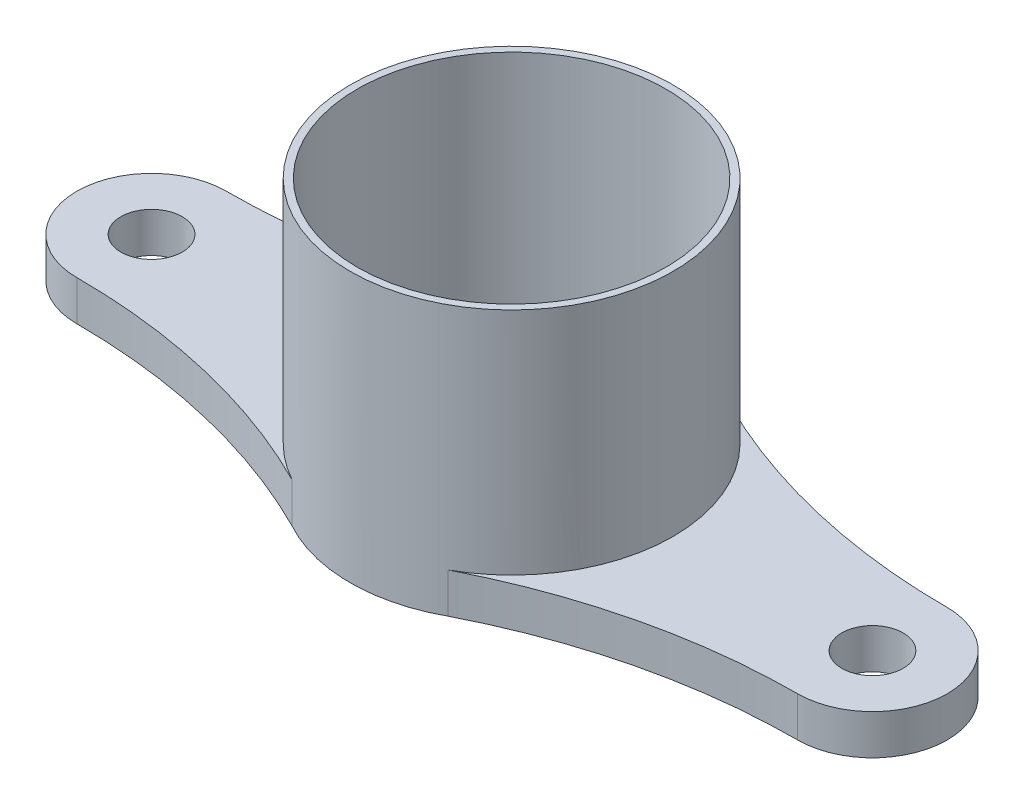
ISO-10303-21;
HEADER;
FILE_DESCRIPTION(('STEP AP214'),'2;1');
FILE_NAME('part.step','',(''),(''),'','','');
FILE_SCHEMA(('AUTOMOTIVE_DESIGN { 1 0 10303 214 1 1 1 1 }'));
ENDSEC;
DATA;
#1=APPLICATION_CONTEXT('core data for automotive mechanical design processes');
#2=APPLICATION_PROTOCOL_DEFINITION('international standard','automotive_design',2000,#1);
#3=PRODUCT_CONTEXT('',#1,'mechanical');
#4=PRODUCT('Part','Part','',(#3));
#5=PRODUCT_RELATED_PRODUCT_CATEGORY('part','',(#4));
#6=PRODUCT_DEFINITION_FORMATION('','',#4);
#7=PRODUCT_DEFINITION_CONTEXT('part definition',#1,'design');
#8=PRODUCT_DEFINITION('design','',#6,#7);
#9=PRODUCT_DEFINITION_SHAPE('','',#8);
#10=(LENGTH_UNIT() NAMED_UNIT(*) SI_UNIT(.MILLI.,.METRE.));
#11=(NAMED_UNIT(*) PLANE_ANGLE_UNIT() SI_UNIT($,.RADIAN.));
#12=(NAMED_UNIT(*) SI_UNIT($,.STERADIAN.) SOLID_ANGLE_UNIT());
#13=UNCERTAINTY_MEASURE_WITH_UNIT(LENGTH_MEASURE(1.E-05),#10,'distance_accuracy_value','');
#14=(GEOMETRIC_REPRESENTATION_CONTEXT(3) GLOBAL_UNCERTAINTY_ASSIGNED_CONTEXT((#13)) GLOBAL_UNIT_ASSIGNED_CONTEXT((#10,
#11,#12)) REPRESENTATION_CONTEXT('',''));
#15=CARTESIAN_POINT('',(0.,0.,0.));
#16=DIRECTION('',(0.,0.,1.));
#17=DIRECTION('',(1.,0.,0.));
#18=AXIS2_PLACEMENT_3D('',#15,#16,#17);
#19=CARTESIAN_POINT('',(0.,1.5,0.));
#20=DIRECTION('',(0.,1.,0.));
#21=DIRECTION('',(0.,0.,1.));
#22=AXIS2_PLACEMENT_3D('',#19,#20,#21);
#23=PLANE('',#22);
#24=CARTESIAN_POINT('',(-13.5176419804261,1.5,-0.031970109339721));
#25=DIRECTION('',(0.,1.,0.));
#26=DIRECTION('',(0.,0.,1.));
#27=AXIS2_PLACEMENT_3D('',#24,#25,#26);
#28=CIRCLE('',#27,1.15);
#29=CARTESIAN_POINT('',(-13.5176419804261,1.5,1.11802989066028));
#30=VERTEX_POINT('',#29);
#31=EDGE_CURVE('E141',#30,#30,#28,.T.);
#32=ORIENTED_EDGE('',*,*,#31,.F.);
#33=EDGE_LOOP('',(#32));
#34=FACE_BOUND('',#33,.T.);
#35=CARTESIAN_POINT('',(-13.5176419804261,1.5,26.2243705707502));
#36=DIRECTION('',(0.,1.,0.));
#37=DIRECTION('',(0.,0.,1.));
#38=AXIS2_PLACEMENT_3D('',#35,#36,#37);
#39=CIRCLE('',#38,23.4563406800899);
#40=CARTESIAN_POINT('',(-13.5176419804261,1.5,2.76802989066028));
#41=VERTEX_POINT('',#40);
#42=CARTESIAN_POINT('',(-2.92303701075554,1.5,5.29701374679671));
#43=VERTEX_POINT('',#42);
#44=EDGE_CURVE('E91',#41,#43,#39,.F.);
#45=ORIENTED_EDGE('',*,*,#44,.T.);
#46=CARTESIAN_POINT('',(0.,1.5,0.));
#47=DIRECTION('',(0.,1.,0.));
#48=DIRECTION('',(0.,0.,1.));
#49=AXIS2_PLACEMENT_3D('',#46,#47,#48);
#50=CIRCLE('',#49,6.05);
#51=CARTESIAN_POINT('',(-2.92303701075541,1.5,-5.29701374679678));
#52=VERTEX_POINT('',#51);
#53=EDGE_CURVE('E133',#43,#52,#50,.F.);
#54=ORIENTED_EDGE('',*,*,#53,.T.);
#55=CARTESIAN_POINT('',(-13.5176419804261,1.5,-26.8319701093397));
#56=DIRECTION('',(0.,1.,0.));
#57=DIRECTION('',(0.,0.,1.));
#58=AXIS2_PLACEMENT_3D('',#55,#56,#57);
#59=CIRCLE('',#58,24.);
#60=CARTESIAN_POINT('',(-13.5176419804261,1.5,-2.83197010933972));
#61=VERTEX_POINT('',#60);
#62=EDGE_CURVE('E117',#61,#52,#59,.T.);
#63=ORIENTED_EDGE('',*,*,#62,.F.);
#64=CARTESIAN_POINT('',(-13.5176419804261,1.5,-0.031970109339721));
#65=DIRECTION('',(0.,1.,0.));
#66=DIRECTION('',(0.,0.,1.));
#67=AXIS2_PLACEMENT_3D('',#64,#65,#66);
#68=CIRCLE('',#67,2.8);
#69=EDGE_CURVE('E144',#61,#41,#68,.T.);
#70=ORIENTED_EDGE('',*,*,#69,.T.);
#71=EDGE_LOOP('',(#45,#54,#63,#70));
#72=FACE_BOUND('',#71,.T.);
#73=ADVANCED_FACE('F32',(#34,#72),#23,.T.);
#74=CARTESIAN_POINT('',(0.,1.5,0.));
#75=DIRECTION('',(0.,1.,0.));
#76=DIRECTION('',(0.,0.,1.));
#77=AXIS2_PLACEMENT_3D('',#74,#75,#76);
#78=CIRCLE('',#77,2.85);
#79=CARTESIAN_POINT('',(0.,1.5,2.85));
#80=VERTEX_POINT('',#79);
#81=EDGE_CURVE('E153',#80,#80,#78,.T.);
#82=ORIENTED_EDGE('',*,*,#81,.F.);
#83=EDGE_LOOP('',(#82));
#84=FACE_BOUND('',#83,.T.);
#85=CARTESIAN_POINT('',(0.,1.5,0.));
#86=DIRECTION('',(0.,1.,0.));
#87=DIRECTION('',(0.,0.,1.));
#88=AXIS2_PLACEMENT_3D('',#85,#86,#87);
#89=CIRCLE('',#88,5.78192035093867);
#90=CARTESIAN_POINT('',(0.,1.5,5.78192035093867));
#91=VERTEX_POINT('',#90);
#92=EDGE_CURVE('E11',#91,#91,#89,.F.);
#93=ORIENTED_EDGE('',*,*,#92,.F.);
#94=EDGE_LOOP('',(#93));
#95=FACE_BOUND('',#94,.T.);
#96=ADVANCED_FACE('F211',(#84,#95),#23,.T.);
#97=CARTESIAN_POINT('',(-13.5176419804261,1.5,-0.031970109339721));
#98=DIRECTION('',(0.,-1.,0.));
#99=DIRECTION('',(0.,0.,-1.));
#100=AXIS2_PLACEMENT_3D('',#97,#98,#99);
#101=CYLINDRICAL_SURFACE('',#100,2.8);
#102=CARTESIAN_POINT('',(-13.5176419804261,0.,-0.031970109339721));
#103=DIRECTION('',(0.,1.,0.));
#104=DIRECTION('',(0.,0.,1.));
#105=AXIS2_PLACEMENT_3D('',#102,#103,#104);
#106=CIRCLE('',#105,2.8);
#107=CARTESIAN_POINT('',(-13.5176419804261,0.,-2.83197010933972));
#108=VERTEX_POINT('',#107);
#109=CARTESIAN_POINT('',(-13.5176419804261,0.,2.76802989066028));
#110=VERTEX_POINT('',#109);
#111=EDGE_CURVE('E161',#108,#110,#106,.T.);
#112=ORIENTED_EDGE('',*,*,#111,.T.);
#113=DIRECTION('',(0.,-1.,0.));
#114=VECTOR('',#113,1.);
#115=CARTESIAN_POINT('',(-13.5176419804261,1.5,2.76802989066028));
#116=LINE('',#115,#114);
#117=EDGE_CURVE('E36',#41,#110,#116,.T.);
#118=ORIENTED_EDGE('',*,*,#117,.F.);
#119=ORIENTED_EDGE('',*,*,#69,.F.);
#120=DIRECTION('',(0.,-1.,0.));
#121=VECTOR('',#120,1.);
#122=CARTESIAN_POINT('',(-13.5176419804261,1.5,-2.83197010933972));
#123=LINE('',#122,#121);
#124=EDGE_CURVE('E50',#61,#108,#123,.T.);
#125=ORIENTED_EDGE('',*,*,#124,.T.);
#126=EDGE_LOOP('',(#112,#118,#119,#125));
#127=FACE_BOUND('',#126,.T.);
#128=ADVANCED_FACE('F193',(#127),#101,.T.);
#129=CARTESIAN_POINT('',(-13.5176419804261,1.5,26.2243705707502));
#130=DIRECTION('',(0.,-1.,0.));
#131=DIRECTION('',(0.,0.,-1.));
#132=AXIS2_PLACEMENT_3D('',#129,#130,#131);
#133=CYLINDRICAL_SURFACE('',#132,23.4563406800899);
#134=CARTESIAN_POINT('',(-13.5176419804261,0.,26.2243705707502));
#135=DIRECTION('',(0.,1.,0.));
#136=DIRECTION('',(0.,0.,1.));
#137=AXIS2_PLACEMENT_3D('',#134,#135,#136);
#138=CIRCLE('',#137,23.4563406800899);
#139=CARTESIAN_POINT('',(-2.92303701075554,0.,5.29701374679671));
#140=VERTEX_POINT('',#139);
#141=EDGE_CURVE('E163',#110,#140,#138,.F.);
#142=ORIENTED_EDGE('',*,*,#141,.T.);
#143=DIRECTION('',(0.,-1.,0.));
#144=VECTOR('',#143,1.);
#145=CARTESIAN_POINT('',(-2.92303701075554,1.5,5.29701374679671));
#146=LINE('',#145,#144);
#147=EDGE_CURVE('E187',#43,#140,#146,.T.);
#148=ORIENTED_EDGE('',*,*,#147,.F.);
#149=ORIENTED_EDGE('',*,*,#44,.F.);
#150=ORIENTED_EDGE('',*,*,#117,.T.);
#151=EDGE_LOOP('',(#142,#148,#149,#150));
#152=FACE_BOUND('',#151,.T.);
#153=ADVANCED_FACE('F192',(#152),#133,.F.);
#154=CARTESIAN_POINT('',(13.4823580195739,1.5,26.0768025476715));
#155=DIRECTION('',(0.,-1.,0.));
#156=DIRECTION('',(0.,0.,-1.));
#157=AXIS2_PLACEMENT_3D('',#154,#155,#156);
#158=CYLINDRICAL_SURFACE('',#157,23.3087726570112);
#159=CARTESIAN_POINT('',(13.4823580195739,0.,26.0768025476715));
#160=DIRECTION('',(0.,1.,0.));
#161=DIRECTION('',(0.,0.,1.));
#162=AXIS2_PLACEMENT_3D('',#159,#160,#161);
#163=CIRCLE('',#162,23.3087726570112);
#164=CARTESIAN_POINT('',(13.4823580195739,0.,2.76802989066028));
#165=VERTEX_POINT('',#164);
#166=CARTESIAN_POINT('',(2.92303701075551,0.,5.29701374679673));
#167=VERTEX_POINT('',#166);
#168=EDGE_CURVE('E167',#165,#167,#163,.T.);
#169=ORIENTED_EDGE('',*,*,#168,.F.);
#170=DIRECTION('',(0.,-1.,0.));
#171=VECTOR('',#170,1.);
#172=CARTESIAN_POINT('',(13.4823580195739,1.5,2.76802989066028));
#173=LINE('',#172,#171);
#174=CARTESIAN_POINT('',(13.4823580195739,1.5,2.76802989066028));
#175=VERTEX_POINT('',#174);
#176=EDGE_CURVE('E185',#175,#165,#173,.T.);
#177=ORIENTED_EDGE('',*,*,#176,.F.);
#178=CARTESIAN_POINT('',(13.4823580195739,1.5,26.0768025476715));
#179=DIRECTION('',(0.,1.,0.));
#180=DIRECTION('',(0.,0.,1.));
#181=AXIS2_PLACEMENT_3D('',#178,#179,#180);
#182=CIRCLE('',#181,23.3087726570112);
#183=CARTESIAN_POINT('',(2.92303701075551,1.5,5.29701374679673));
#184=VERTEX_POINT('',#183);
#185=EDGE_CURVE('E148',#175,#184,#182,.T.);
#186=ORIENTED_EDGE('',*,*,#185,.T.);
#187=DIRECTION('',(0.,-1.,0.));
#188=VECTOR('',#187,1.);
#189=CARTESIAN_POINT('',(2.92303701075551,1.5,5.29701374679673));
#190=LINE('',#189,#188);
#191=EDGE_CURVE('E132',#184,#167,#190,.T.);
#192=ORIENTED_EDGE('',*,*,#191,.T.);
#193=EDGE_LOOP('',(#169,#177,#186,#192));
#194=FACE_BOUND('',#193,.T.);
#195=ADVANCED_FACE('F264',(#194),#158,.F.);
#196=CARTESIAN_POINT('',(13.4823580195739,1.5,-0.0319701093397201));
#197=DIRECTION('',(0.,-1.,0.));
#198=DIRECTION('',(0.,0.,-1.));
#199=AXIS2_PLACEMENT_3D('',#196,#197,#198);
#200=CYLINDRICAL_SURFACE('',#199,2.8);
#201=CARTESIAN_POINT('',(13.4823580195739,0.,-0.0319701093397201));
#202=DIRECTION('',(0.,1.,0.));
#203=DIRECTION('',(0.,0.,1.));
#204=AXIS2_PLACEMENT_3D('',#201,#202,#203);
#205=CIRCLE('',#204,2.8);
#206=CARTESIAN_POINT('',(13.4823580195739,0.,-2.83197010933972));
#207=VERTEX_POINT('',#206);
#208=EDGE_CURVE('E171',#165,#207,#205,.T.);
#209=ORIENTED_EDGE('',*,*,#208,.T.);
#210=DIRECTION('',(0.,-1.,0.));
#211=VECTOR('',#210,1.);
#212=CARTESIAN_POINT('',(13.4823580195739,1.5,-2.83197010933972));
#213=LINE('',#212,#211);
#214=CARTESIAN_POINT('',(13.4823580195739,1.5,-2.83197010933972));
#215=VERTEX_POINT('',#214);
#216=EDGE_CURVE('E126',#215,#207,#213,.T.);
#217=ORIENTED_EDGE('',*,*,#216,.F.);
#218=CARTESIAN_POINT('',(13.4823580195739,1.5,-0.0319701093397201));
#219=DIRECTION('',(0.,1.,0.));
#220=DIRECTION('',(0.,0.,1.));
#221=AXIS2_PLACEMENT_3D('',#218,#219,#220);
#222=CIRCLE('',#221,2.8);
#223=EDGE_CURVE('E113',#175,#215,#222,.T.);
#224=ORIENTED_EDGE('',*,*,#223,.F.);
#225=ORIENTED_EDGE('',*,*,#176,.T.);
#226=EDGE_LOOP('',(#209,#217,#224,#225));
#227=FACE_BOUND('',#226,.T.);
#228=ADVANCED_FACE('F259',(#227),#200,.T.);
#229=CARTESIAN_POINT('',(13.4823580195739,1.5,-26.6805743521299));
#230=DIRECTION('',(0.,-1.,0.));
#231=DIRECTION('',(0.,0.,-1.));
#232=AXIS2_PLACEMENT_3D('',#229,#230,#231);
#233=CYLINDRICAL_SURFACE('',#232,23.8486042427902);
#234=CARTESIAN_POINT('',(13.4823580195739,0.,-26.6805743521299));
#235=DIRECTION('',(0.,1.,0.));
#236=DIRECTION('',(0.,0.,1.));
#237=AXIS2_PLACEMENT_3D('',#234,#235,#236);
#238=CIRCLE('',#237,23.8486042427902);
#239=CARTESIAN_POINT('',(2.92303701075546,0.,-5.29701374679675));
#240=VERTEX_POINT('',#239);
#241=EDGE_CURVE('E123',#207,#240,#238,.F.);
#242=ORIENTED_EDGE('',*,*,#241,.T.);
#243=DIRECTION('',(0.,-1.,0.));
#244=VECTOR('',#243,1.);
#245=CARTESIAN_POINT('',(2.92303701075546,1.5,-5.29701374679675));
#246=LINE('',#245,#244);
#247=CARTESIAN_POINT('',(2.92303701075546,1.5,-5.29701374679675));
#248=VERTEX_POINT('',#247);
#249=EDGE_CURVE('E120',#248,#240,#246,.T.);
#250=ORIENTED_EDGE('',*,*,#249,.F.);
#251=CARTESIAN_POINT('',(13.4823580195739,1.5,-26.6805743521299));
#252=DIRECTION('',(0.,1.,0.));
#253=DIRECTION('',(0.,0.,1.));
#254=AXIS2_PLACEMENT_3D('',#251,#252,#253);
#255=CIRCLE('',#254,23.8486042427902);
#256=EDGE_CURVE('E105',#215,#248,#255,.F.);
#257=ORIENTED_EDGE('',*,*,#256,.F.);
#258=ORIENTED_EDGE('',*,*,#216,.T.);
#259=EDGE_LOOP('',(#242,#250,#257,#258));
#260=FACE_BOUND('',#259,.T.);
#261=ADVANCED_FACE('F121',(#260),#233,.F.);
#262=CARTESIAN_POINT('',(0.,1.5,0.));
#263=DIRECTION('',(0.,-1.,0.));
#264=DIRECTION('',(0.,0.,-1.));
#265=AXIS2_PLACEMENT_3D('',#262,#263,#264);
#266=CYLINDRICAL_SURFACE('',#265,6.05);
#267=CARTESIAN_POINT('',(0.,0.,0.));
#268=DIRECTION('',(0.,1.,0.));
#269=DIRECTION('',(0.,0.,1.));
#270=AXIS2_PLACEMENT_3D('',#267,#268,#269);
#271=CIRCLE('',#270,6.05);
#272=CARTESIAN_POINT('',(-2.92303701075541,0.,-5.29701374679678));
#273=VERTEX_POINT('',#272);
#274=EDGE_CURVE('E168',#240,#273,#271,.T.);
#275=ORIENTED_EDGE('',*,*,#274,.T.);
#276=DIRECTION('',(0.,-1.,0.));
#277=VECTOR('',#276,1.);
#278=CARTESIAN_POINT('',(-2.92303701075541,1.5,-5.29701374679678));
#279=LINE('',#278,#277);
#280=EDGE_CURVE('E78',#52,#273,#279,.T.);
#281=ORIENTED_EDGE('',*,*,#280,.F.);
#282=ORIENTED_EDGE('',*,*,#53,.F.);
#283=ORIENTED_EDGE('',*,*,#147,.T.);
#284=EDGE_CURVE('E165',#140,#167,#271,.T.);
#285=ORIENTED_EDGE('',*,*,#284,.T.);
#286=ORIENTED_EDGE('',*,*,#191,.F.);
#287=EDGE_CURVE('E111',#248,#184,#50,.F.);
#288=ORIENTED_EDGE('',*,*,#287,.F.);
#289=ORIENTED_EDGE('',*,*,#249,.T.);
#290=EDGE_LOOP('',(#275,#281,#282,#283,#285,#286,#288,#289));
#291=FACE_BOUND('',#290,.T.);
#292=CARTESIAN_POINT('',(0.,10.1,0.));
#293=DIRECTION('',(0.,1.,0.));
#294=DIRECTION('',(0.,0.,1.));
#295=AXIS2_PLACEMENT_3D('',#292,#293,#294);
#296=CIRCLE('',#295,6.05);
#297=CARTESIAN_POINT('',(0.,10.1,6.05));
#298=VERTEX_POINT('',#297);
#299=EDGE_CURVE('E134',#298,#298,#296,.T.);
#300=ORIENTED_EDGE('',*,*,#299,.F.);
#301=EDGE_LOOP('',(#300));
#302=FACE_BOUND('',#301,.T.);
#303=ADVANCED_FACE('F129',(#291,#302),#266,.T.);
#304=CARTESIAN_POINT('',(0.,1.5,0.));
#305=DIRECTION('',(0.,-1.,0.));
#306=DIRECTION('',(0.,0.,-1.));
#307=AXIS2_PLACEMENT_3D('',#304,#305,#306);
#308=CYLINDRICAL_SURFACE('',#307,2.85);
#309=ORIENTED_EDGE('',*,*,#81,.T.);
#310=EDGE_LOOP('',(#309));
#311=FACE_BOUND('',#310,.T.);
#312=CARTESIAN_POINT('',(0.,0.,0.));
#313=DIRECTION('',(0.,1.,0.));
#314=DIRECTION('',(0.,0.,1.));
#315=AXIS2_PLACEMENT_3D('',#312,#313,#314);
#316=CIRCLE('',#315,2.85);
#317=CARTESIAN_POINT('',(0.,0.,2.85));
#318=VERTEX_POINT('',#317);
#319=EDGE_CURVE('E177',#318,#318,#316,.T.);
#320=ORIENTED_EDGE('',*,*,#319,.F.);
#321=EDGE_LOOP('',(#320));
#322=FACE_BOUND('',#321,.T.);
#323=ADVANCED_FACE('F199',(#311,#322),#308,.F.);
#324=CARTESIAN_POINT('',(-13.5176419804261,1.5,-26.8319701093397));
#325=DIRECTION('',(0.,-1.,0.));
#326=DIRECTION('',(0.,0.,-1.));
#327=AXIS2_PLACEMENT_3D('',#324,#325,#326);
#328=CYLINDRICAL_SURFACE('',#327,24.);
#329=CARTESIAN_POINT('',(-13.5176419804261,0.,-26.8319701093397));
#330=DIRECTION('',(0.,1.,0.));
#331=DIRECTION('',(0.,0.,1.));
#332=AXIS2_PLACEMENT_3D('',#329,#330,#331);
#333=CIRCLE('',#332,24.);
#334=EDGE_CURVE('E174',#108,#273,#333,.T.);
#335=ORIENTED_EDGE('',*,*,#334,.F.);
#336=ORIENTED_EDGE('',*,*,#124,.F.);
#337=ORIENTED_EDGE('',*,*,#62,.T.);
#338=ORIENTED_EDGE('',*,*,#280,.T.);
#339=EDGE_LOOP('',(#335,#336,#337,#338));
#340=FACE_BOUND('',#339,.T.);
#341=ADVANCED_FACE('F197',(#340),#328,.F.);
#342=CARTESIAN_POINT('',(-13.5176419804261,1.5,-0.031970109339721));
#343=DIRECTION('',(0.,-1.,0.));
#344=DIRECTION('',(0.,0.,-1.));
#345=AXIS2_PLACEMENT_3D('',#342,#343,#344);
#346=CYLINDRICAL_SURFACE('',#345,1.15);
#347=ORIENTED_EDGE('',*,*,#31,.T.);
#348=EDGE_LOOP('',(#347));
#349=FACE_BOUND('',#348,.T.);
#350=CARTESIAN_POINT('',(-13.5176419804261,0.,-0.031970109339721));
#351=DIRECTION('',(0.,1.,0.));
#352=DIRECTION('',(0.,0.,1.));
#353=AXIS2_PLACEMENT_3D('',#350,#351,#352);
#354=CIRCLE('',#353,1.15);
#355=CARTESIAN_POINT('',(-13.5176419804261,0.,1.11802989066028));
#356=VERTEX_POINT('',#355);
#357=EDGE_CURVE('E136',#356,#356,#354,.T.);
#358=ORIENTED_EDGE('',*,*,#357,.F.);
#359=EDGE_LOOP('',(#358));
#360=FACE_BOUND('',#359,.T.);
#361=ADVANCED_FACE('F34',(#349,#360),#346,.F.);
#362=CARTESIAN_POINT('',(13.4823580195739,1.5,-0.0319701093397201));
#363=DIRECTION('',(0.,-1.,0.));
#364=DIRECTION('',(0.,0.,-1.));
#365=AXIS2_PLACEMENT_3D('',#362,#363,#364);
#366=CYLINDRICAL_SURFACE('',#365,1.15);
#367=CARTESIAN_POINT('',(13.4823580195739,1.5,-0.0319701093397201));
#368=DIRECTION('',(0.,1.,0.));
#369=DIRECTION('',(0.,0.,1.));
#370=AXIS2_PLACEMENT_3D('',#367,#368,#369);
#371=CIRCLE('',#370,1.15);
#372=CARTESIAN_POINT('',(13.4823580195739,1.5,1.11802989066028));
#373=VERTEX_POINT('',#372);
#374=EDGE_CURVE('E156',#373,#373,#371,.T.);
#375=ORIENTED_EDGE('',*,*,#374,.T.);
#376=EDGE_LOOP('',(#375));
#377=FACE_BOUND('',#376,.T.);
#378=CARTESIAN_POINT('',(13.4823580195739,0.,-0.0319701093397201));
#379=DIRECTION('',(0.,1.,0.));
#380=DIRECTION('',(0.,0.,1.));
#381=AXIS2_PLACEMENT_3D('',#378,#379,#380);
#382=CIRCLE('',#381,1.15);
#383=CARTESIAN_POINT('',(13.4823580195739,0.,1.11802989066028));
#384=VERTEX_POINT('',#383);
#385=EDGE_CURVE('E145',#384,#384,#382,.T.);
#386=ORIENTED_EDGE('',*,*,#385,.F.);
#387=EDGE_LOOP('',(#386));
#388=FACE_BOUND('',#387,.T.);
#389=ADVANCED_FACE('F205',(#377,#388),#366,.F.);
#390=ORIENTED_EDGE('',*,*,#256,.T.);
#391=ORIENTED_EDGE('',*,*,#287,.T.);
#392=ORIENTED_EDGE('',*,*,#185,.F.);
#393=ORIENTED_EDGE('',*,*,#223,.T.);
#394=EDGE_LOOP('',(#390,#391,#392,#393));
#395=FACE_BOUND('',#394,.T.);
#396=ORIENTED_EDGE('',*,*,#374,.F.);
#397=EDGE_LOOP('',(#396));
#398=FACE_BOUND('',#397,.T.);
#399=ADVANCED_FACE('F107',(#395,#398),#23,.T.);
#400=CARTESIAN_POINT('',(0.,0.,0.));
#401=DIRECTION('',(0.,1.,0.));
#402=DIRECTION('',(0.,0.,1.));
#403=AXIS2_PLACEMENT_3D('',#400,#401,#402);
#404=PLANE('',#403);
#405=ORIENTED_EDGE('',*,*,#168,.T.);
#406=ORIENTED_EDGE('',*,*,#284,.F.);
#407=ORIENTED_EDGE('',*,*,#141,.F.);
#408=ORIENTED_EDGE('',*,*,#111,.F.);
#409=ORIENTED_EDGE('',*,*,#334,.T.);
#410=ORIENTED_EDGE('',*,*,#274,.F.);
#411=ORIENTED_EDGE('',*,*,#241,.F.);
#412=ORIENTED_EDGE('',*,*,#208,.F.);
#413=EDGE_LOOP('',(#405,#406,#407,#408,#409,#410,#411,#412));
#414=FACE_BOUND('',#413,.T.);
#415=ORIENTED_EDGE('',*,*,#385,.T.);
#416=EDGE_LOOP('',(#415));
#417=FACE_BOUND('',#416,.T.);
#418=ORIENTED_EDGE('',*,*,#319,.T.);
#419=EDGE_LOOP('',(#418));
#420=FACE_BOUND('',#419,.T.);
#421=ORIENTED_EDGE('',*,*,#357,.T.);
#422=EDGE_LOOP('',(#421));
#423=FACE_BOUND('',#422,.T.);
#424=ADVANCED_FACE('F195',(#414,#417,#420,#423),#404,.F.);
#425=CARTESIAN_POINT('',(0.,10.1,0.));
#426=DIRECTION('',(0.,1.,0.));
#427=DIRECTION('',(0.,0.,1.));
#428=AXIS2_PLACEMENT_3D('',#425,#426,#427);
#429=PLANE('',#428);
#430=ORIENTED_EDGE('',*,*,#299,.T.);
#431=EDGE_LOOP('',(#430));
#432=FACE_BOUND('',#431,.T.);
#433=CARTESIAN_POINT('',(0.,10.1,0.));
#434=DIRECTION('',(0.,1.,0.));
#435=DIRECTION('',(0.,0.,1.));
#436=AXIS2_PLACEMENT_3D('',#433,#434,#435);
#437=CIRCLE('',#436,5.78192035093867);
#438=CARTESIAN_POINT('',(0.,10.1,5.78192035093867));
#439=VERTEX_POINT('',#438);
#440=EDGE_CURVE('E138',#439,#439,#437,.T.);
#441=ORIENTED_EDGE('',*,*,#440,.F.);
#442=EDGE_LOOP('',(#441));
#443=FACE_BOUND('',#442,.T.);
#444=ADVANCED_FACE('F227',(#432,#443),#429,.T.);
#445=CARTESIAN_POINT('',(0.,10.1,0.));
#446=DIRECTION('',(0.,-1.,0.));
#447=DIRECTION('',(0.,0.,-1.));
#448=AXIS2_PLACEMENT_3D('',#445,#446,#447);
#449=CYLINDRICAL_SURFACE('',#448,5.78192035093867);
#450=ORIENTED_EDGE('',*,*,#92,.T.);
#451=EDGE_LOOP('',(#450));
#452=FACE_BOUND('',#451,.T.);
#453=ORIENTED_EDGE('',*,*,#440,.T.);
#454=EDGE_LOOP('',(#453));
#455=FACE_BOUND('',#454,.T.);
#456=ADVANCED_FACE('F334',(#452,#455),#449,.F.);
#457=CLOSED_SHELL('',(#73,#96,#128,#153,#195,#228,#261,#303,#323,#341,#361,#389,#399,#424,#444,#456));
#458=MANIFOLD_SOLID_BREP('B2',#457);
#459=ADVANCED_BREP_SHAPE_REPRESENTATION('',(#18,#458),#14);
#460=SHAPE_DEFINITION_REPRESENTATION(#9,#459);
ENDSEC;
END-ISO-10303-21;
